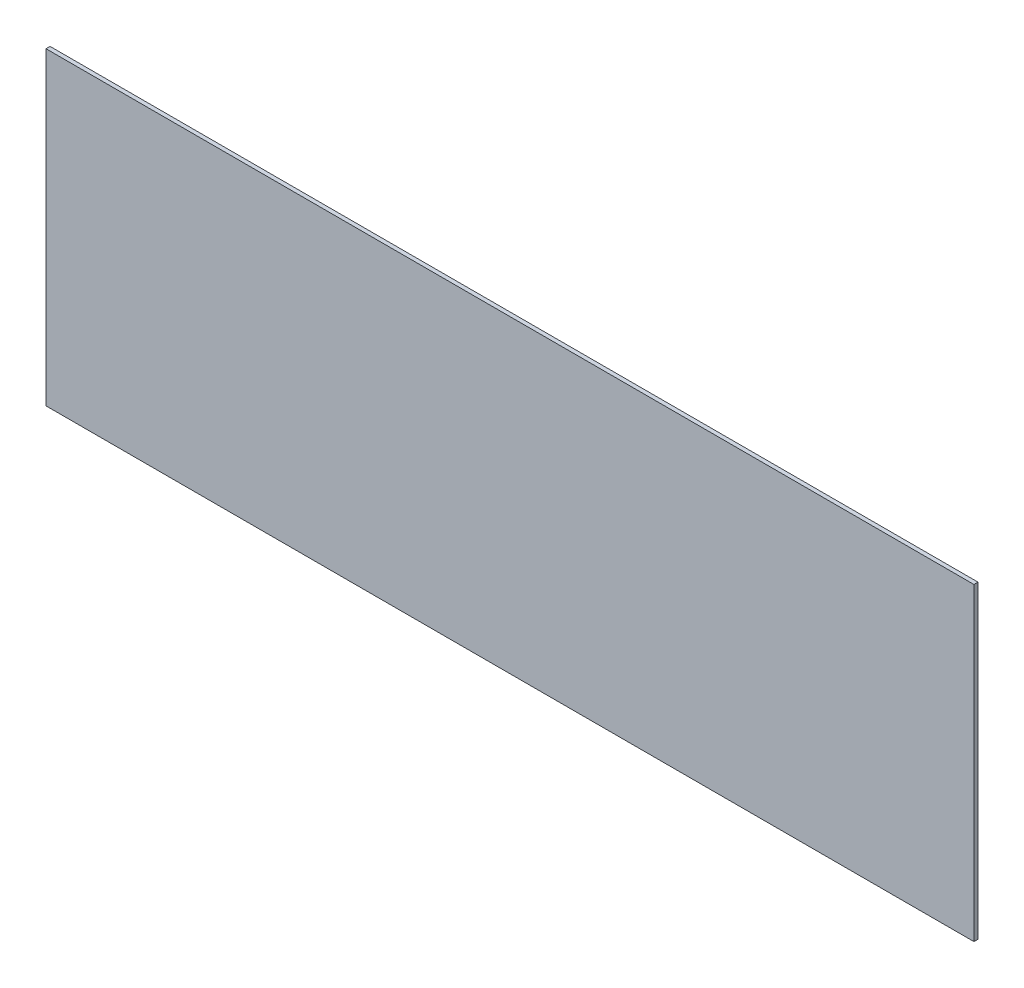
ISO-10303-21;
HEADER;
FILE_DESCRIPTION(('STEP AP214'),'2;1');
FILE_NAME('part.step','',(''),(''),'','','');
FILE_SCHEMA(('AUTOMOTIVE_DESIGN { 1 0 10303 214 1 1 1 1 }'));
ENDSEC;
DATA;
#1=APPLICATION_CONTEXT('core data for automotive mechanical design processes');
#2=APPLICATION_PROTOCOL_DEFINITION('international standard','automotive_design',2000,#1);
#3=PRODUCT_CONTEXT('',#1,'mechanical');
#4=PRODUCT('Part','Part','',(#3));
#5=PRODUCT_RELATED_PRODUCT_CATEGORY('part','',(#4));
#6=PRODUCT_DEFINITION_FORMATION('','',#4);
#7=PRODUCT_DEFINITION_CONTEXT('part definition',#1,'design');
#8=PRODUCT_DEFINITION('design','',#6,#7);
#9=PRODUCT_DEFINITION_SHAPE('','',#8);
#10=(LENGTH_UNIT() NAMED_UNIT(*) SI_UNIT(.MILLI.,.METRE.));
#11=(NAMED_UNIT(*) PLANE_ANGLE_UNIT() SI_UNIT($,.RADIAN.));
#12=(NAMED_UNIT(*) SI_UNIT($,.STERADIAN.) SOLID_ANGLE_UNIT());
#13=UNCERTAINTY_MEASURE_WITH_UNIT(LENGTH_MEASURE(1.E-05),#10,'distance_accuracy_value','');
#14=(GEOMETRIC_REPRESENTATION_CONTEXT(3) GLOBAL_UNCERTAINTY_ASSIGNED_CONTEXT((#13)) GLOBAL_UNIT_ASSIGNED_CONTEXT((#10,
#11,#12)) REPRESENTATION_CONTEXT('',''));
#15=CARTESIAN_POINT('',(0.,0.,0.));
#16=DIRECTION('',(0.,0.,1.));
#17=DIRECTION('',(1.,0.,0.));
#18=AXIS2_PLACEMENT_3D('',#15,#16,#17);
#19=CARTESIAN_POINT('',(7.51796588203408,41.2750000150576,73.630539983));
#20=DIRECTION('',(0.,0.,-1.));
#21=DIRECTION('',(0.,-1.,0.));
#22=AXIS2_PLACEMENT_3D('',#19,#20,#21);
#23=PLANE('',#22);
#24=DIRECTION('',(0.,-1.,0.));
#25=VECTOR('',#24,1.);
#26=CARTESIAN_POINT('',(7.51796588203408,41.2750000150576,73.630539983));
#27=LINE('',#26,#25);
#28=CARTESIAN_POINT('',(7.51796588203408,60.3250000150577,73.630539983));
#29=VERTEX_POINT('',#28);
#30=CARTESIAN_POINT('',(7.51796588203408,41.2750000150576,73.630539983));
#31=VERTEX_POINT('',#30);
#32=EDGE_CURVE('E119',#29,#31,#27,.T.);
#33=ORIENTED_EDGE('',*,*,#32,.F.);
#34=DIRECTION('',(-1.,0.,0.));
#35=VECTOR('',#34,1.);
#36=CARTESIAN_POINT('',(7.51796588203408,60.3250000150577,73.630539983));
#37=LINE('',#36,#35);
#38=CARTESIAN_POINT('',(64.6679658820341,60.3250000150577,73.630539983));
#39=VERTEX_POINT('',#38);
#40=EDGE_CURVE('E28',#39,#29,#37,.T.);
#41=ORIENTED_EDGE('',*,*,#40,.F.);
#42=DIRECTION('',(0.,1.,0.));
#43=VECTOR('',#42,1.);
#44=CARTESIAN_POINT('',(64.6679658820341,41.2750000150576,73.630539983));
#45=LINE('',#44,#43);
#46=CARTESIAN_POINT('',(64.6679658820341,41.2750000150576,73.630539983));
#47=VERTEX_POINT('',#46);
#48=EDGE_CURVE('E91',#47,#39,#45,.T.);
#49=ORIENTED_EDGE('',*,*,#48,.F.);
#50=DIRECTION('',(1.,0.,0.));
#51=VECTOR('',#50,1.);
#52=CARTESIAN_POINT('',(7.51796588203408,41.2750000150576,73.630539983));
#53=LINE('',#52,#51);
#54=EDGE_CURVE('E56',#31,#47,#53,.T.);
#55=ORIENTED_EDGE('',*,*,#54,.F.);
#56=EDGE_LOOP('',(#33,#41,#49,#55));
#57=FACE_BOUND('',#56,.T.);
#58=ADVANCED_FACE('F17',(#57),#23,.T.);
#59=CARTESIAN_POINT('',(7.51796588203408,41.2750000150576,73.880539983));
#60=DIRECTION('',(0.,0.,-1.));
#61=DIRECTION('',(0.,-1.,0.));
#62=AXIS2_PLACEMENT_3D('',#59,#60,#61);
#63=PLANE('',#62);
#64=DIRECTION('',(0.,-1.,0.));
#65=VECTOR('',#64,1.);
#66=CARTESIAN_POINT('',(7.51796588203408,41.2750000150576,73.880539983));
#67=LINE('',#66,#65);
#68=CARTESIAN_POINT('',(7.51796588203408,60.3250000150577,73.880539983));
#69=VERTEX_POINT('',#68);
#70=CARTESIAN_POINT('',(7.51796588203408,41.2750000150576,73.880539983));
#71=VERTEX_POINT('',#70);
#72=EDGE_CURVE('E87',#69,#71,#67,.T.);
#73=ORIENTED_EDGE('',*,*,#72,.T.);
#74=DIRECTION('',(1.,0.,0.));
#75=VECTOR('',#74,1.);
#76=CARTESIAN_POINT('',(7.51796588203408,41.2750000150576,73.880539983));
#77=LINE('',#76,#75);
#78=CARTESIAN_POINT('',(64.6679658820341,41.2750000150576,73.880539983));
#79=VERTEX_POINT('',#78);
#80=EDGE_CURVE('E85',#71,#79,#77,.T.);
#81=ORIENTED_EDGE('',*,*,#80,.T.);
#82=DIRECTION('',(0.,1.,0.));
#83=VECTOR('',#82,1.);
#84=CARTESIAN_POINT('',(64.6679658820341,41.2750000150576,73.880539983));
#85=LINE('',#84,#83);
#86=CARTESIAN_POINT('',(64.6679658820341,60.3250000150577,73.880539983));
#87=VERTEX_POINT('',#86);
#88=EDGE_CURVE('E21',#79,#87,#85,.T.);
#89=ORIENTED_EDGE('',*,*,#88,.T.);
#90=DIRECTION('',(-1.,0.,0.));
#91=VECTOR('',#90,1.);
#92=CARTESIAN_POINT('',(7.51796588203408,60.3250000150577,73.880539983));
#93=LINE('',#92,#91);
#94=EDGE_CURVE('E11',#87,#69,#93,.T.);
#95=ORIENTED_EDGE('',*,*,#94,.T.);
#96=EDGE_LOOP('',(#73,#81,#89,#95));
#97=FACE_BOUND('',#96,.T.);
#98=ADVANCED_FACE('F19',(#97),#63,.F.);
#99=CARTESIAN_POINT('',(7.51796588203408,60.3250000150577,73.880539983));
#100=DIRECTION('',(0.,-1.,0.));
#101=DIRECTION('',(0.,0.,-1.));
#102=AXIS2_PLACEMENT_3D('',#99,#100,#101);
#103=PLANE('',#102);
#104=ORIENTED_EDGE('',*,*,#40,.T.);
#105=DIRECTION('',(0.,0.,-1.));
#106=VECTOR('',#105,1.);
#107=CARTESIAN_POINT('',(7.51796588203408,60.3250000150577,73.880539983));
#108=LINE('',#107,#106);
#109=EDGE_CURVE('E100',#69,#29,#108,.T.);
#110=ORIENTED_EDGE('',*,*,#109,.F.);
#111=ORIENTED_EDGE('',*,*,#94,.F.);
#112=DIRECTION('',(0.,0.,-1.));
#113=VECTOR('',#112,1.);
#114=CARTESIAN_POINT('',(64.6679658820341,60.3250000150577,73.880539983));
#115=LINE('',#114,#113);
#116=EDGE_CURVE('E81',#87,#39,#115,.T.);
#117=ORIENTED_EDGE('',*,*,#116,.T.);
#118=EDGE_LOOP('',(#104,#110,#111,#117));
#119=FACE_BOUND('',#118,.T.);
#120=ADVANCED_FACE('F134',(#119),#103,.F.);
#121=CARTESIAN_POINT('',(64.6679658820341,41.2750000150576,73.880539983));
#122=DIRECTION('',(-1.,0.,0.));
#123=DIRECTION('',(0.,0.,1.));
#124=AXIS2_PLACEMENT_3D('',#121,#122,#123);
#125=PLANE('',#124);
#126=ORIENTED_EDGE('',*,*,#48,.T.);
#127=ORIENTED_EDGE('',*,*,#116,.F.);
#128=ORIENTED_EDGE('',*,*,#88,.F.);
#129=DIRECTION('',(0.,0.,-1.));
#130=VECTOR('',#129,1.);
#131=CARTESIAN_POINT('',(64.6679658820341,41.2750000150576,73.880539983));
#132=LINE('',#131,#130);
#133=EDGE_CURVE('E80',#79,#47,#132,.T.);
#134=ORIENTED_EDGE('',*,*,#133,.T.);
#135=EDGE_LOOP('',(#126,#127,#128,#134));
#136=FACE_BOUND('',#135,.T.);
#137=ADVANCED_FACE('F78',(#136),#125,.F.);
#138=CARTESIAN_POINT('',(7.51796588203408,41.2750000150576,73.880539983));
#139=DIRECTION('',(0.,1.,0.));
#140=DIRECTION('',(1.,0.,0.));
#141=AXIS2_PLACEMENT_3D('',#138,#139,#140);
#142=PLANE('',#141);
#143=ORIENTED_EDGE('',*,*,#54,.T.);
#144=ORIENTED_EDGE('',*,*,#133,.F.);
#145=ORIENTED_EDGE('',*,*,#80,.F.);
#146=DIRECTION('',(0.,0.,-1.));
#147=VECTOR('',#146,1.);
#148=CARTESIAN_POINT('',(7.51796588203408,41.2750000150576,73.880539983));
#149=LINE('',#148,#147);
#150=EDGE_CURVE('E104',#71,#31,#149,.T.);
#151=ORIENTED_EDGE('',*,*,#150,.T.);
#152=EDGE_LOOP('',(#143,#144,#145,#151));
#153=FACE_BOUND('',#152,.T.);
#154=ADVANCED_FACE('F93',(#153),#142,.F.);
#155=CARTESIAN_POINT('',(7.51796588203408,41.2750000150576,73.880539983));
#156=DIRECTION('',(1.,0.,0.));
#157=DIRECTION('',(0.,1.,0.));
#158=AXIS2_PLACEMENT_3D('',#155,#156,#157);
#159=PLANE('',#158);
#160=ORIENTED_EDGE('',*,*,#32,.T.);
#161=ORIENTED_EDGE('',*,*,#150,.F.);
#162=ORIENTED_EDGE('',*,*,#72,.F.);
#163=ORIENTED_EDGE('',*,*,#109,.T.);
#164=EDGE_LOOP('',(#160,#161,#162,#163));
#165=FACE_BOUND('',#164,.T.);
#166=ADVANCED_FACE('F127',(#165),#159,.F.);
#167=CLOSED_SHELL('',(#58,#98,#120,#137,#154,#166));
#168=MANIFOLD_SOLID_BREP('B1',#167);
#169=ADVANCED_BREP_SHAPE_REPRESENTATION('',(#18,#168),#14);
#170=SHAPE_DEFINITION_REPRESENTATION(#9,#169);
ENDSEC;
END-ISO-10303-21;
